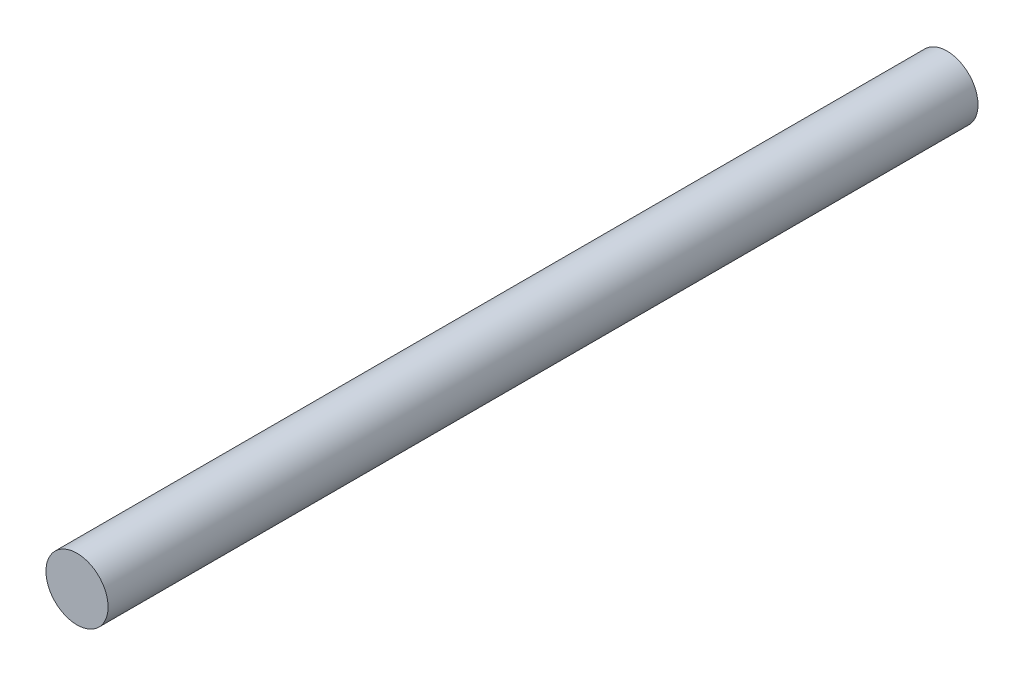
ISO-10303-21;
HEADER;
FILE_DESCRIPTION(('STEP AP214'),'2;1');
FILE_NAME('part.step','',(''),(''),'','','');
FILE_SCHEMA(('AUTOMOTIVE_DESIGN { 1 0 10303 214 1 1 1 1 }'));
ENDSEC;
DATA;
#1=APPLICATION_CONTEXT('core data for automotive mechanical design processes');
#2=APPLICATION_PROTOCOL_DEFINITION('international standard','automotive_design',2000,#1);
#3=PRODUCT_CONTEXT('',#1,'mechanical');
#4=PRODUCT('Part','Part','',(#3));
#5=PRODUCT_RELATED_PRODUCT_CATEGORY('part','',(#4));
#6=PRODUCT_DEFINITION_FORMATION('','',#4);
#7=PRODUCT_DEFINITION_CONTEXT('part definition',#1,'design');
#8=PRODUCT_DEFINITION('design','',#6,#7);
#9=PRODUCT_DEFINITION_SHAPE('','',#8);
#10=(LENGTH_UNIT() NAMED_UNIT(*) SI_UNIT(.MILLI.,.METRE.));
#11=(NAMED_UNIT(*) PLANE_ANGLE_UNIT() SI_UNIT($,.RADIAN.));
#12=(NAMED_UNIT(*) SI_UNIT($,.STERADIAN.) SOLID_ANGLE_UNIT());
#13=UNCERTAINTY_MEASURE_WITH_UNIT(LENGTH_MEASURE(1.E-05),#10,'distance_accuracy_value','');
#14=(GEOMETRIC_REPRESENTATION_CONTEXT(3) GLOBAL_UNCERTAINTY_ASSIGNED_CONTEXT((#13)) GLOBAL_UNIT_ASSIGNED_CONTEXT((#10,
#11,#12)) REPRESENTATION_CONTEXT('',''));
#15=CARTESIAN_POINT('',(0.,0.,0.));
#16=DIRECTION('',(0.,0.,1.));
#17=DIRECTION('',(1.,0.,0.));
#18=AXIS2_PLACEMENT_3D('',#15,#16,#17);
#19=CARTESIAN_POINT('',(0.,0.,-70.));
#20=DIRECTION('',(0.,0.,1.));
#21=DIRECTION('',(1.,0.,0.));
#22=AXIS2_PLACEMENT_3D('',#19,#20,#21);
#23=CYLINDRICAL_SURFACE('',#22,2.5);
#24=CARTESIAN_POINT('',(0.,0.,-70.));
#25=DIRECTION('',(0.,0.,1.));
#26=DIRECTION('',(1.,0.,0.));
#27=AXIS2_PLACEMENT_3D('',#24,#25,#26);
#28=CIRCLE('',#27,2.5);
#29=CARTESIAN_POINT('',(2.5,0.,-70.));
#30=VERTEX_POINT('',#29);
#31=EDGE_CURVE('E10',#30,#30,#28,.T.);
#32=ORIENTED_EDGE('',*,*,#31,.T.);
#33=EDGE_LOOP('',(#32));
#34=FACE_BOUND('',#33,.T.);
#35=CARTESIAN_POINT('',(0.,0.,0.));
#36=DIRECTION('',(0.,0.,1.));
#37=DIRECTION('',(1.,0.,0.));
#38=AXIS2_PLACEMENT_3D('',#35,#36,#37);
#39=CIRCLE('',#38,2.5);
#40=CARTESIAN_POINT('',(2.5,0.,0.));
#41=VERTEX_POINT('',#40);
#42=EDGE_CURVE('E44',#41,#41,#39,.T.);
#43=ORIENTED_EDGE('',*,*,#42,.F.);
#44=EDGE_LOOP('',(#43));
#45=FACE_BOUND('',#44,.T.);
#46=ADVANCED_FACE('F41',(#34,#45),#23,.T.);
#47=CARTESIAN_POINT('',(0.,0.,-70.));
#48=DIRECTION('',(0.,0.,1.));
#49=DIRECTION('',(1.,0.,0.));
#50=AXIS2_PLACEMENT_3D('',#47,#48,#49);
#51=PLANE('',#50);
#52=ORIENTED_EDGE('',*,*,#31,.F.);
#53=EDGE_LOOP('',(#52));
#54=FACE_BOUND('',#53,.T.);
#55=ADVANCED_FACE('F58',(#54),#51,.F.);
#56=CARTESIAN_POINT('',(0.,0.,0.));
#57=DIRECTION('',(0.,0.,1.));
#58=DIRECTION('',(1.,0.,0.));
#59=AXIS2_PLACEMENT_3D('',#56,#57,#58);
#60=PLANE('',#59);
#61=ORIENTED_EDGE('',*,*,#42,.T.);
#62=EDGE_LOOP('',(#61));
#63=FACE_BOUND('',#62,.T.);
#64=ADVANCED_FACE('F55',(#63),#60,.T.);
#65=CLOSED_SHELL('',(#46,#55,#64));
#66=MANIFOLD_SOLID_BREP('B2',#65);
#67=ADVANCED_BREP_SHAPE_REPRESENTATION('',(#18,#66),#14);
#68=SHAPE_DEFINITION_REPRESENTATION(#9,#67);
ENDSEC;
END-ISO-10303-21;
